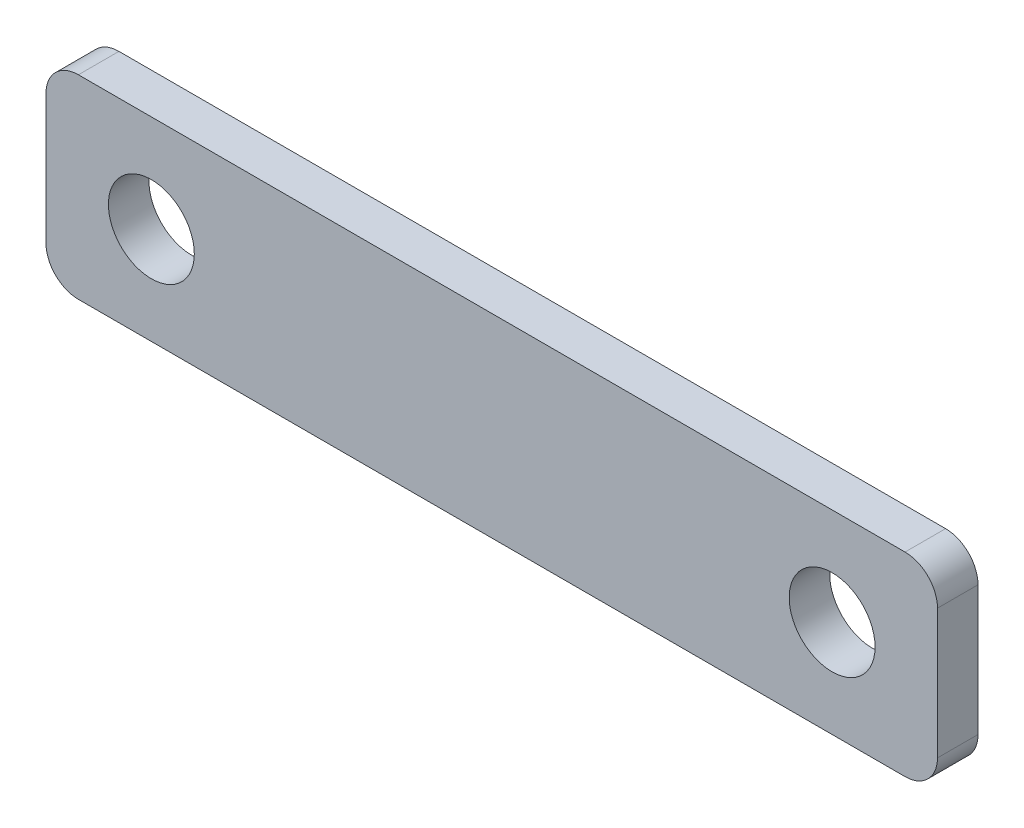
ISO-10303-21;
HEADER;
FILE_DESCRIPTION(('STEP AP214'),'2;1');
FILE_NAME('part.step','',(''),(''),'','','');
FILE_SCHEMA(('AUTOMOTIVE_DESIGN { 1 0 10303 214 1 1 1 1 }'));
ENDSEC;
DATA;
#1=APPLICATION_CONTEXT('core data for automotive mechanical design processes');
#2=APPLICATION_PROTOCOL_DEFINITION('international standard','automotive_design',2000,#1);
#3=PRODUCT_CONTEXT('',#1,'mechanical');
#4=PRODUCT('Part','Part','',(#3));
#5=PRODUCT_RELATED_PRODUCT_CATEGORY('part','',(#4));
#6=PRODUCT_DEFINITION_FORMATION('','',#4);
#7=PRODUCT_DEFINITION_CONTEXT('part definition',#1,'design');
#8=PRODUCT_DEFINITION('design','',#6,#7);
#9=PRODUCT_DEFINITION_SHAPE('','',#8);
#10=(LENGTH_UNIT() NAMED_UNIT(*) SI_UNIT(.MILLI.,.METRE.));
#11=(NAMED_UNIT(*) PLANE_ANGLE_UNIT() SI_UNIT($,.RADIAN.));
#12=(NAMED_UNIT(*) SI_UNIT($,.STERADIAN.) SOLID_ANGLE_UNIT());
#13=UNCERTAINTY_MEASURE_WITH_UNIT(LENGTH_MEASURE(1.E-05),#10,'distance_accuracy_value','');
#14=(GEOMETRIC_REPRESENTATION_CONTEXT(3) GLOBAL_UNCERTAINTY_ASSIGNED_CONTEXT((#13)) GLOBAL_UNIT_ASSIGNED_CONTEXT((#10,
#11,#12)) REPRESENTATION_CONTEXT('',''));
#15=CARTESIAN_POINT('',(0.,0.,0.));
#16=DIRECTION('',(0.,0.,1.));
#17=DIRECTION('',(1.,0.,0.));
#18=AXIS2_PLACEMENT_3D('',#15,#16,#17);
#19=CARTESIAN_POINT('',(0.,0.,0.));
#20=DIRECTION('',(0.,0.,1.));
#21=DIRECTION('',(1.,0.,0.));
#22=AXIS2_PLACEMENT_3D('',#19,#20,#21);
#23=PLANE('',#22);
#24=CARTESIAN_POINT('',(21.,0.,0.));
#25=DIRECTION('',(0.,0.,-1.));
#26=DIRECTION('',(-1.,0.,0.));
#27=AXIS2_PLACEMENT_3D('',#24,#25,#26);
#28=CIRCLE('',#27,2.65);
#29=CARTESIAN_POINT('',(23.65,0.,0.));
#30=VERTEX_POINT('',#29);
#31=EDGE_CURVE('E241',#30,#30,#28,.T.);
#32=ORIENTED_EDGE('',*,*,#31,.F.);
#33=EDGE_LOOP('',(#32));
#34=FACE_BOUND('',#33,.T.);
#35=CARTESIAN_POINT('',(-21.,0.,0.));
#36=DIRECTION('',(0.,0.,-1.));
#37=DIRECTION('',(-1.,0.,0.));
#38=AXIS2_PLACEMENT_3D('',#35,#36,#37);
#39=CIRCLE('',#38,2.65);
#40=CARTESIAN_POINT('',(-18.35,0.,0.));
#41=VERTEX_POINT('',#40);
#42=EDGE_CURVE('E140',#41,#41,#39,.T.);
#43=ORIENTED_EDGE('',*,*,#42,.F.);
#44=EDGE_LOOP('',(#43));
#45=FACE_BOUND('',#44,.T.);
#46=CARTESIAN_POINT('',(-25.5,-4.,0.));
#47=DIRECTION('',(0.,0.,1.));
#48=DIRECTION('',(-1.,0.,0.));
#49=AXIS2_PLACEMENT_3D('',#46,#47,#48);
#50=CIRCLE('',#49,2.);
#51=CARTESIAN_POINT('',(-27.5,-4.,0.));
#52=VERTEX_POINT('',#51);
#53=CARTESIAN_POINT('',(-25.5,-6.,0.));
#54=VERTEX_POINT('',#53);
#55=EDGE_CURVE('E27',#52,#54,#50,.T.);
#56=ORIENTED_EDGE('',*,*,#55,.F.);
#57=DIRECTION('',(0.,-1.,0.));
#58=VECTOR('',#57,1.);
#59=CARTESIAN_POINT('',(-27.5,4.,0.));
#60=LINE('',#59,#58);
#61=CARTESIAN_POINT('',(-27.5,4.,0.));
#62=VERTEX_POINT('',#61);
#63=EDGE_CURVE('E120',#62,#52,#60,.T.);
#64=ORIENTED_EDGE('',*,*,#63,.F.);
#65=CARTESIAN_POINT('',(-25.5,4.,0.));
#66=DIRECTION('',(0.,0.,1.));
#67=DIRECTION('',(0.,1.,0.));
#68=AXIS2_PLACEMENT_3D('',#65,#66,#67);
#69=CIRCLE('',#68,2.);
#70=CARTESIAN_POINT('',(-25.5,6.,0.));
#71=VERTEX_POINT('',#70);
#72=EDGE_CURVE('E155',#71,#62,#69,.T.);
#73=ORIENTED_EDGE('',*,*,#72,.F.);
#74=DIRECTION('',(-1.,0.,0.));
#75=VECTOR('',#74,1.);
#76=CARTESIAN_POINT('',(25.5,6.,0.));
#77=LINE('',#76,#75);
#78=CARTESIAN_POINT('',(25.5,6.,0.));
#79=VERTEX_POINT('',#78);
#80=EDGE_CURVE('E159',#79,#71,#77,.T.);
#81=ORIENTED_EDGE('',*,*,#80,.F.);
#82=CARTESIAN_POINT('',(25.5,4.,0.));
#83=DIRECTION('',(0.,0.,1.));
#84=DIRECTION('',(1.,0.,0.));
#85=AXIS2_PLACEMENT_3D('',#82,#83,#84);
#86=CIRCLE('',#85,2.);
#87=CARTESIAN_POINT('',(27.5,4.,0.));
#88=VERTEX_POINT('',#87);
#89=EDGE_CURVE('E164',#88,#79,#86,.T.);
#90=ORIENTED_EDGE('',*,*,#89,.F.);
#91=DIRECTION('',(0.,1.,0.));
#92=VECTOR('',#91,1.);
#93=CARTESIAN_POINT('',(27.5,-4.,0.));
#94=LINE('',#93,#92);
#95=CARTESIAN_POINT('',(27.5,-4.,0.));
#96=VERTEX_POINT('',#95);
#97=EDGE_CURVE('E179',#96,#88,#94,.T.);
#98=ORIENTED_EDGE('',*,*,#97,.F.);
#99=CARTESIAN_POINT('',(25.5,-4.,0.));
#100=DIRECTION('',(0.,0.,1.));
#101=DIRECTION('',(0.,-1.,0.));
#102=AXIS2_PLACEMENT_3D('',#99,#100,#101);
#103=CIRCLE('',#102,2.);
#104=CARTESIAN_POINT('',(25.5,-6.,0.));
#105=VERTEX_POINT('',#104);
#106=EDGE_CURVE('E187',#105,#96,#103,.T.);
#107=ORIENTED_EDGE('',*,*,#106,.F.);
#108=DIRECTION('',(1.,0.,0.));
#109=VECTOR('',#108,1.);
#110=CARTESIAN_POINT('',(-25.5,-6.,0.));
#111=LINE('',#110,#109);
#112=EDGE_CURVE('E125',#54,#105,#111,.T.);
#113=ORIENTED_EDGE('',*,*,#112,.F.);
#114=EDGE_LOOP('',(#56,#64,#73,#81,#90,#98,#107,#113));
#115=FACE_BOUND('',#114,.T.);
#116=ADVANCED_FACE('F17',(#34,#45,#115),#23,.F.);
#117=CARTESIAN_POINT('',(0.,0.,2.5));
#118=DIRECTION('',(0.,0.,1.));
#119=DIRECTION('',(1.,0.,0.));
#120=AXIS2_PLACEMENT_3D('',#117,#118,#119);
#121=PLANE('',#120);
#122=CARTESIAN_POINT('',(21.,0.,2.5));
#123=DIRECTION('',(0.,0.,-1.));
#124=DIRECTION('',(-1.,0.,0.));
#125=AXIS2_PLACEMENT_3D('',#122,#123,#124);
#126=CIRCLE('',#125,2.65);
#127=CARTESIAN_POINT('',(23.65,0.,2.5));
#128=VERTEX_POINT('',#127);
#129=EDGE_CURVE('E288',#128,#128,#126,.T.);
#130=ORIENTED_EDGE('',*,*,#129,.T.);
#131=EDGE_LOOP('',(#130));
#132=FACE_BOUND('',#131,.T.);
#133=CARTESIAN_POINT('',(-21.,0.,2.5));
#134=DIRECTION('',(0.,0.,-1.));
#135=DIRECTION('',(-1.,0.,0.));
#136=AXIS2_PLACEMENT_3D('',#133,#134,#135);
#137=CIRCLE('',#136,2.65);
#138=CARTESIAN_POINT('',(-18.35,0.,2.5));
#139=VERTEX_POINT('',#138);
#140=EDGE_CURVE('E243',#139,#139,#137,.T.);
#141=ORIENTED_EDGE('',*,*,#140,.T.);
#142=EDGE_LOOP('',(#141));
#143=FACE_BOUND('',#142,.T.);
#144=CARTESIAN_POINT('',(-25.5,-4.,2.5));
#145=DIRECTION('',(0.,0.,1.));
#146=DIRECTION('',(-1.,0.,0.));
#147=AXIS2_PLACEMENT_3D('',#144,#145,#146);
#148=CIRCLE('',#147,2.);
#149=CARTESIAN_POINT('',(-27.5,-4.,2.5));
#150=VERTEX_POINT('',#149);
#151=CARTESIAN_POINT('',(-25.5,-6.,2.5));
#152=VERTEX_POINT('',#151);
#153=EDGE_CURVE('E11',#150,#152,#148,.T.);
#154=ORIENTED_EDGE('',*,*,#153,.T.);
#155=DIRECTION('',(1.,0.,0.));
#156=VECTOR('',#155,1.);
#157=CARTESIAN_POINT('',(-25.5,-6.,2.5));
#158=LINE('',#157,#156);
#159=CARTESIAN_POINT('',(25.5,-6.,2.5));
#160=VERTEX_POINT('',#159);
#161=EDGE_CURVE('E199',#152,#160,#158,.T.);
#162=ORIENTED_EDGE('',*,*,#161,.T.);
#163=CARTESIAN_POINT('',(25.5,-4.,2.5));
#164=DIRECTION('',(0.,0.,1.));
#165=DIRECTION('',(0.,-1.,0.));
#166=AXIS2_PLACEMENT_3D('',#163,#164,#165);
#167=CIRCLE('',#166,2.);
#168=CARTESIAN_POINT('',(27.5,-4.,2.5));
#169=VERTEX_POINT('',#168);
#170=EDGE_CURVE('E192',#160,#169,#167,.T.);
#171=ORIENTED_EDGE('',*,*,#170,.T.);
#172=DIRECTION('',(0.,1.,0.));
#173=VECTOR('',#172,1.);
#174=CARTESIAN_POINT('',(27.5,-4.,2.5));
#175=LINE('',#174,#173);
#176=CARTESIAN_POINT('',(27.5,4.,2.5));
#177=VERTEX_POINT('',#176);
#178=EDGE_CURVE('E185',#169,#177,#175,.T.);
#179=ORIENTED_EDGE('',*,*,#178,.T.);
#180=CARTESIAN_POINT('',(25.5,4.,2.5));
#181=DIRECTION('',(0.,0.,1.));
#182=DIRECTION('',(1.,0.,0.));
#183=AXIS2_PLACEMENT_3D('',#180,#181,#182);
#184=CIRCLE('',#183,2.);
#185=CARTESIAN_POINT('',(25.5,6.,2.5));
#186=VERTEX_POINT('',#185);
#187=EDGE_CURVE('E171',#177,#186,#184,.T.);
#188=ORIENTED_EDGE('',*,*,#187,.T.);
#189=DIRECTION('',(-1.,0.,0.));
#190=VECTOR('',#189,1.);
#191=CARTESIAN_POINT('',(25.5,6.,2.5));
#192=LINE('',#191,#190);
#193=CARTESIAN_POINT('',(-25.5,6.,2.5));
#194=VERTEX_POINT('',#193);
#195=EDGE_CURVE('E167',#186,#194,#192,.T.);
#196=ORIENTED_EDGE('',*,*,#195,.T.);
#197=CARTESIAN_POINT('',(-25.5,4.,2.5));
#198=DIRECTION('',(0.,0.,1.));
#199=DIRECTION('',(0.,1.,0.));
#200=AXIS2_PLACEMENT_3D('',#197,#198,#199);
#201=CIRCLE('',#200,2.);
#202=CARTESIAN_POINT('',(-27.5,4.,2.5));
#203=VERTEX_POINT('',#202);
#204=EDGE_CURVE('E153',#194,#203,#201,.T.);
#205=ORIENTED_EDGE('',*,*,#204,.T.);
#206=DIRECTION('',(0.,-1.,0.));
#207=VECTOR('',#206,1.);
#208=CARTESIAN_POINT('',(-27.5,4.,2.5));
#209=LINE('',#208,#207);
#210=EDGE_CURVE('E129',#203,#150,#209,.T.);
#211=ORIENTED_EDGE('',*,*,#210,.T.);
#212=EDGE_LOOP('',(#154,#162,#171,#179,#188,#196,#205,#211));
#213=FACE_BOUND('',#212,.T.);
#214=ADVANCED_FACE('F211',(#132,#143,#213),#121,.T.);
#215=CARTESIAN_POINT('',(-25.5,-4.,0.));
#216=DIRECTION('',(0.,0.,1.));
#217=DIRECTION('',(-1.,0.,0.));
#218=AXIS2_PLACEMENT_3D('',#215,#216,#217);
#219=CYLINDRICAL_SURFACE('',#218,2.);
#220=ORIENTED_EDGE('',*,*,#55,.T.);
#221=DIRECTION('',(0.,0.,1.));
#222=VECTOR('',#221,1.);
#223=CARTESIAN_POINT('',(-25.5,-6.,0.));
#224=LINE('',#223,#222);
#225=EDGE_CURVE('E121',#54,#152,#224,.T.);
#226=ORIENTED_EDGE('',*,*,#225,.T.);
#227=ORIENTED_EDGE('',*,*,#153,.F.);
#228=DIRECTION('',(0.,0.,1.));
#229=VECTOR('',#228,1.);
#230=CARTESIAN_POINT('',(-27.5,-4.,0.));
#231=LINE('',#230,#229);
#232=EDGE_CURVE('E130',#52,#150,#231,.T.);
#233=ORIENTED_EDGE('',*,*,#232,.F.);
#234=EDGE_LOOP('',(#220,#226,#227,#233));
#235=FACE_BOUND('',#234,.T.);
#236=ADVANCED_FACE('F19',(#235),#219,.T.);
#237=CARTESIAN_POINT('',(-25.5,-6.,0.));
#238=DIRECTION('',(0.,-1.,0.));
#239=DIRECTION('',(0.,0.,-1.));
#240=AXIS2_PLACEMENT_3D('',#237,#238,#239);
#241=PLANE('',#240);
#242=ORIENTED_EDGE('',*,*,#112,.T.);
#243=DIRECTION('',(0.,0.,1.));
#244=VECTOR('',#243,1.);
#245=CARTESIAN_POINT('',(25.5,-6.,0.));
#246=LINE('',#245,#244);
#247=EDGE_CURVE('E191',#105,#160,#246,.T.);
#248=ORIENTED_EDGE('',*,*,#247,.T.);
#249=ORIENTED_EDGE('',*,*,#161,.F.);
#250=ORIENTED_EDGE('',*,*,#225,.F.);
#251=EDGE_LOOP('',(#242,#248,#249,#250));
#252=FACE_BOUND('',#251,.T.);
#253=ADVANCED_FACE('F208',(#252),#241,.T.);
#254=CARTESIAN_POINT('',(25.5,-4.,0.));
#255=DIRECTION('',(0.,0.,1.));
#256=DIRECTION('',(0.,-1.,0.));
#257=AXIS2_PLACEMENT_3D('',#254,#255,#256);
#258=CYLINDRICAL_SURFACE('',#257,2.);
#259=ORIENTED_EDGE('',*,*,#106,.T.);
#260=DIRECTION('',(0.,0.,1.));
#261=VECTOR('',#260,1.);
#262=CARTESIAN_POINT('',(27.5,-4.,0.));
#263=LINE('',#262,#261);
#264=EDGE_CURVE('E182',#96,#169,#263,.T.);
#265=ORIENTED_EDGE('',*,*,#264,.T.);
#266=ORIENTED_EDGE('',*,*,#170,.F.);
#267=ORIENTED_EDGE('',*,*,#247,.F.);
#268=EDGE_LOOP('',(#259,#265,#266,#267));
#269=FACE_BOUND('',#268,.T.);
#270=ADVANCED_FACE('F214',(#269),#258,.T.);
#271=CARTESIAN_POINT('',(27.5,-4.,0.));
#272=DIRECTION('',(1.,0.,0.));
#273=DIRECTION('',(0.,1.,0.));
#274=AXIS2_PLACEMENT_3D('',#271,#272,#273);
#275=PLANE('',#274);
#276=ORIENTED_EDGE('',*,*,#97,.T.);
#277=DIRECTION('',(0.,0.,1.));
#278=VECTOR('',#277,1.);
#279=CARTESIAN_POINT('',(27.5,4.,0.));
#280=LINE('',#279,#278);
#281=EDGE_CURVE('E173',#88,#177,#280,.T.);
#282=ORIENTED_EDGE('',*,*,#281,.T.);
#283=ORIENTED_EDGE('',*,*,#178,.F.);
#284=ORIENTED_EDGE('',*,*,#264,.F.);
#285=EDGE_LOOP('',(#276,#282,#283,#284));
#286=FACE_BOUND('',#285,.T.);
#287=ADVANCED_FACE('F217',(#286),#275,.T.);
#288=CARTESIAN_POINT('',(25.5,4.,0.));
#289=DIRECTION('',(0.,0.,1.));
#290=DIRECTION('',(1.,0.,0.));
#291=AXIS2_PLACEMENT_3D('',#288,#289,#290);
#292=CYLINDRICAL_SURFACE('',#291,2.);
#293=ORIENTED_EDGE('',*,*,#89,.T.);
#294=DIRECTION('',(0.,0.,1.));
#295=VECTOR('',#294,1.);
#296=CARTESIAN_POINT('',(25.5,6.,0.));
#297=LINE('',#296,#295);
#298=EDGE_CURVE('E161',#79,#186,#297,.T.);
#299=ORIENTED_EDGE('',*,*,#298,.T.);
#300=ORIENTED_EDGE('',*,*,#187,.F.);
#301=ORIENTED_EDGE('',*,*,#281,.F.);
#302=EDGE_LOOP('',(#293,#299,#300,#301));
#303=FACE_BOUND('',#302,.T.);
#304=ADVANCED_FACE('F224',(#303),#292,.T.);
#305=CARTESIAN_POINT('',(25.5,6.,0.));
#306=DIRECTION('',(0.,1.,0.));
#307=DIRECTION('',(1.,0.,0.));
#308=AXIS2_PLACEMENT_3D('',#305,#306,#307);
#309=PLANE('',#308);
#310=ORIENTED_EDGE('',*,*,#80,.T.);
#311=DIRECTION('',(0.,0.,1.));
#312=VECTOR('',#311,1.);
#313=CARTESIAN_POINT('',(-25.5,6.,0.));
#314=LINE('',#313,#312);
#315=EDGE_CURVE('E156',#71,#194,#314,.T.);
#316=ORIENTED_EDGE('',*,*,#315,.T.);
#317=ORIENTED_EDGE('',*,*,#195,.F.);
#318=ORIENTED_EDGE('',*,*,#298,.F.);
#319=EDGE_LOOP('',(#310,#316,#317,#318));
#320=FACE_BOUND('',#319,.T.);
#321=ADVANCED_FACE('F228',(#320),#309,.T.);
#322=CARTESIAN_POINT('',(-25.5,4.,0.));
#323=DIRECTION('',(0.,0.,1.));
#324=DIRECTION('',(0.,1.,0.));
#325=AXIS2_PLACEMENT_3D('',#322,#323,#324);
#326=CYLINDRICAL_SURFACE('',#325,2.);
#327=ORIENTED_EDGE('',*,*,#72,.T.);
#328=DIRECTION('',(0.,0.,1.));
#329=VECTOR('',#328,1.);
#330=CARTESIAN_POINT('',(-27.5,4.,0.));
#331=LINE('',#330,#329);
#332=EDGE_CURVE('E134',#62,#203,#331,.T.);
#333=ORIENTED_EDGE('',*,*,#332,.T.);
#334=ORIENTED_EDGE('',*,*,#204,.F.);
#335=ORIENTED_EDGE('',*,*,#315,.F.);
#336=EDGE_LOOP('',(#327,#333,#334,#335));
#337=FACE_BOUND('',#336,.T.);
#338=ADVANCED_FACE('F235',(#337),#326,.T.);
#339=CARTESIAN_POINT('',(-27.5,4.,0.));
#340=DIRECTION('',(-1.,0.,0.));
#341=DIRECTION('',(0.,0.,1.));
#342=AXIS2_PLACEMENT_3D('',#339,#340,#341);
#343=PLANE('',#342);
#344=ORIENTED_EDGE('',*,*,#63,.T.);
#345=ORIENTED_EDGE('',*,*,#232,.T.);
#346=ORIENTED_EDGE('',*,*,#210,.F.);
#347=ORIENTED_EDGE('',*,*,#332,.F.);
#348=EDGE_LOOP('',(#344,#345,#346,#347));
#349=FACE_BOUND('',#348,.T.);
#350=ADVANCED_FACE('F132',(#349),#343,.T.);
#351=CARTESIAN_POINT('',(-21.,0.,0.));
#352=DIRECTION('',(0.,0.,1.));
#353=DIRECTION('',(-1.,0.,0.));
#354=AXIS2_PLACEMENT_3D('',#351,#352,#353);
#355=CYLINDRICAL_SURFACE('',#354,2.65);
#356=ORIENTED_EDGE('',*,*,#140,.F.);
#357=DIRECTION('',(0.,0.,-1.));
#358=VECTOR('',#357,1.);
#359=CARTESIAN_POINT('',(-18.35,0.,0.));
#360=LINE('',#359,#358);
#361=EDGE_CURVE('E141',#139,#41,#360,.T.);
#362=ORIENTED_EDGE('',*,*,#361,.T.);
#363=ORIENTED_EDGE('',*,*,#42,.T.);
#364=ORIENTED_EDGE('',*,*,#361,.F.);
#365=EDGE_LOOP('',(#356,#362,#363,#364));
#366=FACE_BOUND('',#365,.T.);
#367=ADVANCED_FACE('F310',(#366),#355,.F.);
#368=CARTESIAN_POINT('',(21.,0.,0.));
#369=DIRECTION('',(0.,0.,1.));
#370=DIRECTION('',(-1.,0.,0.));
#371=AXIS2_PLACEMENT_3D('',#368,#369,#370);
#372=CYLINDRICAL_SURFACE('',#371,2.65);
#373=ORIENTED_EDGE('',*,*,#129,.F.);
#374=DIRECTION('',(0.,0.,-1.));
#375=VECTOR('',#374,1.);
#376=CARTESIAN_POINT('',(23.65,0.,0.));
#377=LINE('',#376,#375);
#378=EDGE_CURVE('E238',#128,#30,#377,.T.);
#379=ORIENTED_EDGE('',*,*,#378,.T.);
#380=ORIENTED_EDGE('',*,*,#31,.T.);
#381=ORIENTED_EDGE('',*,*,#378,.F.);
#382=EDGE_LOOP('',(#373,#379,#380,#381));
#383=FACE_BOUND('',#382,.T.);
#384=ADVANCED_FACE('F299',(#383),#372,.F.);
#385=CLOSED_SHELL('',(#116,#214,#236,#253,#270,#287,#304,#321,#338,#350,#367,#384));
#386=MANIFOLD_SOLID_BREP('B1',#385);
#387=ADVANCED_BREP_SHAPE_REPRESENTATION('',(#18,#386),#14);
#388=SHAPE_DEFINITION_REPRESENTATION(#9,#387);
ENDSEC;
END-ISO-10303-21;
